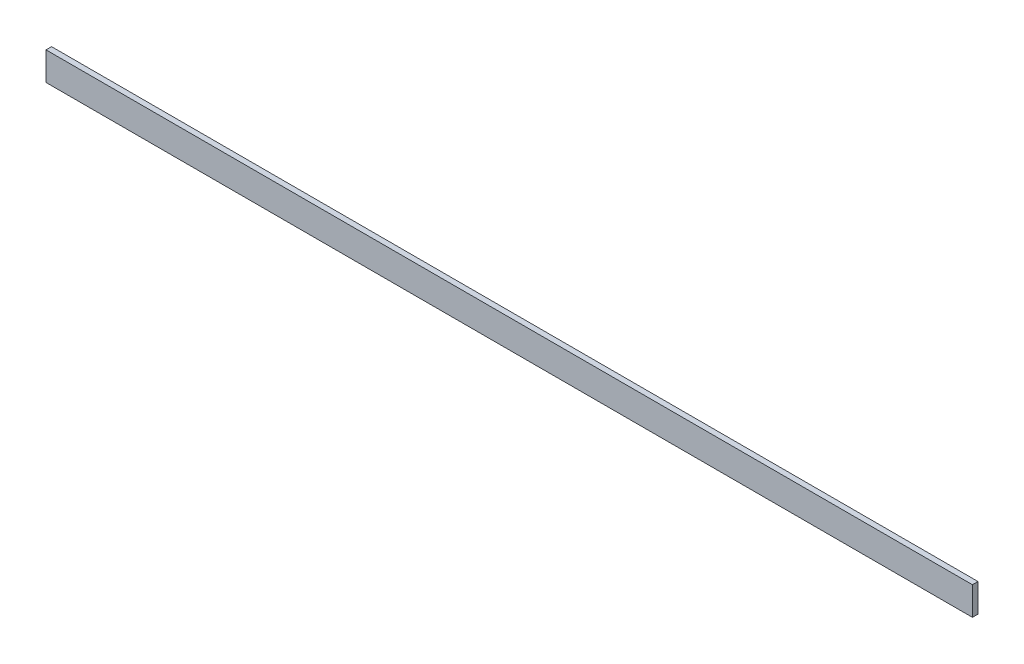
ISO-10303-21;
HEADER;
FILE_DESCRIPTION(('STEP AP214'),'2;1');
FILE_NAME('part.step','',(''),(''),'','','');
FILE_SCHEMA(('AUTOMOTIVE_DESIGN { 1 0 10303 214 1 1 1 1 }'));
ENDSEC;
DATA;
#1=APPLICATION_CONTEXT('core data for automotive mechanical design processes');
#2=APPLICATION_PROTOCOL_DEFINITION('international standard','automotive_design',2000,#1);
#3=PRODUCT_CONTEXT('',#1,'mechanical');
#4=PRODUCT('Part','Part','',(#3));
#5=PRODUCT_RELATED_PRODUCT_CATEGORY('part','',(#4));
#6=PRODUCT_DEFINITION_FORMATION('','',#4);
#7=PRODUCT_DEFINITION_CONTEXT('part definition',#1,'design');
#8=PRODUCT_DEFINITION('design','',#6,#7);
#9=PRODUCT_DEFINITION_SHAPE('','',#8);
#10=(LENGTH_UNIT() NAMED_UNIT(*) SI_UNIT(.MILLI.,.METRE.));
#11=(NAMED_UNIT(*) PLANE_ANGLE_UNIT() SI_UNIT($,.RADIAN.));
#12=(NAMED_UNIT(*) SI_UNIT($,.STERADIAN.) SOLID_ANGLE_UNIT());
#13=UNCERTAINTY_MEASURE_WITH_UNIT(LENGTH_MEASURE(1.E-05),#10,'distance_accuracy_value','');
#14=(GEOMETRIC_REPRESENTATION_CONTEXT(3) GLOBAL_UNCERTAINTY_ASSIGNED_CONTEXT((#13)) GLOBAL_UNIT_ASSIGNED_CONTEXT((#10,
#11,#12)) REPRESENTATION_CONTEXT('',''));
#15=CARTESIAN_POINT('',(0.,0.,0.));
#16=DIRECTION('',(0.,0.,1.));
#17=DIRECTION('',(1.,0.,0.));
#18=AXIS2_PLACEMENT_3D('',#15,#16,#17);
#19=CARTESIAN_POINT('',(-917.357864146204,-236.982,10.));
#20=DIRECTION('',(1.,0.,0.));
#21=DIRECTION('',(0.,0.,-1.));
#22=AXIS2_PLACEMENT_3D('',#19,#20,#21);
#23=PLANE('',#22);
#24=DIRECTION('',(0.,-1.,0.));
#25=VECTOR('',#24,1.);
#26=CARTESIAN_POINT('',(-917.357864146204,-236.982,0.));
#27=LINE('',#26,#25);
#28=CARTESIAN_POINT('',(-917.357864146204,-236.982,0.));
#29=VERTEX_POINT('',#28);
#30=CARTESIAN_POINT('',(-917.357864146204,-287.781,0.));
#31=VERTEX_POINT('',#30);
#32=EDGE_CURVE('E95',#29,#31,#27,.T.);
#33=ORIENTED_EDGE('',*,*,#32,.T.);
#34=DIRECTION('',(0.,0.,-1.));
#35=VECTOR('',#34,1.);
#36=CARTESIAN_POINT('',(-917.357864146204,-287.781,10.));
#37=LINE('',#36,#35);
#38=CARTESIAN_POINT('',(-917.357864146204,-287.781,10.));
#39=VERTEX_POINT('',#38);
#40=EDGE_CURVE('E11',#39,#31,#37,.T.);
#41=ORIENTED_EDGE('',*,*,#40,.F.);
#42=DIRECTION('',(0.,-1.,0.));
#43=VECTOR('',#42,1.);
#44=CARTESIAN_POINT('',(-917.357864146204,-236.982,10.));
#45=LINE('',#44,#43);
#46=CARTESIAN_POINT('',(-917.357864146204,-236.982,10.));
#47=VERTEX_POINT('',#46);
#48=EDGE_CURVE('E83',#47,#39,#45,.T.);
#49=ORIENTED_EDGE('',*,*,#48,.F.);
#50=DIRECTION('',(0.,0.,-1.));
#51=VECTOR('',#50,1.);
#52=CARTESIAN_POINT('',(-917.357864146204,-236.982,10.));
#53=LINE('',#52,#51);
#54=EDGE_CURVE('E91',#47,#29,#53,.T.);
#55=ORIENTED_EDGE('',*,*,#54,.T.);
#56=EDGE_LOOP('',(#33,#41,#49,#55));
#57=FACE_BOUND('',#56,.T.);
#58=ADVANCED_FACE('F32',(#57),#23,.F.);
#59=CARTESIAN_POINT('',(-917.357864146204,-287.781,10.));
#60=DIRECTION('',(0.,1.,0.));
#61=DIRECTION('',(0.,0.,1.));
#62=AXIS2_PLACEMENT_3D('',#59,#60,#61);
#63=PLANE('',#62);
#64=DIRECTION('',(1.,0.,0.));
#65=VECTOR('',#64,1.);
#66=CARTESIAN_POINT('',(-917.357864146204,-287.781,0.));
#67=LINE('',#66,#65);
#68=CARTESIAN_POINT('',(746.937280316701,-287.781,0.));
#69=VERTEX_POINT('',#68);
#70=EDGE_CURVE('E87',#31,#69,#67,.T.);
#71=ORIENTED_EDGE('',*,*,#70,.T.);
#72=DIRECTION('',(0.,0.,-1.));
#73=VECTOR('',#72,1.);
#74=CARTESIAN_POINT('',(746.937280316701,-287.781,10.));
#75=LINE('',#74,#73);
#76=CARTESIAN_POINT('',(746.937280316701,-287.781,10.));
#77=VERTEX_POINT('',#76);
#78=EDGE_CURVE('E40',#77,#69,#75,.T.);
#79=ORIENTED_EDGE('',*,*,#78,.F.);
#80=DIRECTION('',(1.,0.,0.));
#81=VECTOR('',#80,1.);
#82=CARTESIAN_POINT('',(-917.357864146204,-287.781,10.));
#83=LINE('',#82,#81);
#84=EDGE_CURVE('E78',#39,#77,#83,.T.);
#85=ORIENTED_EDGE('',*,*,#84,.F.);
#86=ORIENTED_EDGE('',*,*,#40,.T.);
#87=EDGE_LOOP('',(#71,#79,#85,#86));
#88=FACE_BOUND('',#87,.T.);
#89=ADVANCED_FACE('F86',(#88),#63,.F.);
#90=CARTESIAN_POINT('',(746.937280316701,-236.982,10.));
#91=DIRECTION('',(-1.,0.,0.));
#92=DIRECTION('',(0.,0.,1.));
#93=AXIS2_PLACEMENT_3D('',#90,#91,#92);
#94=PLANE('',#93);
#95=DIRECTION('',(0.,1.,0.));
#96=VECTOR('',#95,1.);
#97=CARTESIAN_POINT('',(746.937280316701,-236.982,0.));
#98=LINE('',#97,#96);
#99=CARTESIAN_POINT('',(746.937280316701,-236.982,0.));
#100=VERTEX_POINT('',#99);
#101=EDGE_CURVE('E65',#69,#100,#98,.T.);
#102=ORIENTED_EDGE('',*,*,#101,.T.);
#103=DIRECTION('',(0.,0.,-1.));
#104=VECTOR('',#103,1.);
#105=CARTESIAN_POINT('',(746.937280316701,-236.982,10.));
#106=LINE('',#105,#104);
#107=CARTESIAN_POINT('',(746.937280316701,-236.982,10.));
#108=VERTEX_POINT('',#107);
#109=EDGE_CURVE('E88',#108,#100,#106,.T.);
#110=ORIENTED_EDGE('',*,*,#109,.F.);
#111=DIRECTION('',(0.,1.,0.));
#112=VECTOR('',#111,1.);
#113=CARTESIAN_POINT('',(746.937280316701,-236.982,10.));
#114=LINE('',#113,#112);
#115=EDGE_CURVE('E81',#77,#108,#114,.T.);
#116=ORIENTED_EDGE('',*,*,#115,.F.);
#117=ORIENTED_EDGE('',*,*,#78,.T.);
#118=EDGE_LOOP('',(#102,#110,#116,#117));
#119=FACE_BOUND('',#118,.T.);
#120=ADVANCED_FACE('F89',(#119),#94,.F.);
#121=CARTESIAN_POINT('',(-917.357864146204,-236.982,10.));
#122=DIRECTION('',(0.,-1.,0.));
#123=DIRECTION('',(0.,0.,-1.));
#124=AXIS2_PLACEMENT_3D('',#121,#122,#123);
#125=PLANE('',#124);
#126=DIRECTION('',(-1.,0.,0.));
#127=VECTOR('',#126,1.);
#128=CARTESIAN_POINT('',(-917.357864146204,-236.982,0.));
#129=LINE('',#128,#127);
#130=EDGE_CURVE('E71',#100,#29,#129,.T.);
#131=ORIENTED_EDGE('',*,*,#130,.T.);
#132=ORIENTED_EDGE('',*,*,#54,.F.);
#133=DIRECTION('',(-1.,0.,0.));
#134=VECTOR('',#133,1.);
#135=CARTESIAN_POINT('',(-917.357864146204,-236.982,10.));
#136=LINE('',#135,#134);
#137=EDGE_CURVE('E48',#108,#47,#136,.T.);
#138=ORIENTED_EDGE('',*,*,#137,.F.);
#139=ORIENTED_EDGE('',*,*,#109,.T.);
#140=EDGE_LOOP('',(#131,#132,#138,#139));
#141=FACE_BOUND('',#140,.T.);
#142=ADVANCED_FACE('F102',(#141),#125,.F.);
#143=CARTESIAN_POINT('',(0.,0.,10.));
#144=DIRECTION('',(0.,0.,1.));
#145=DIRECTION('',(1.,0.,0.));
#146=AXIS2_PLACEMENT_3D('',#143,#144,#145);
#147=PLANE('',#146);
#148=ORIENTED_EDGE('',*,*,#48,.T.);
#149=ORIENTED_EDGE('',*,*,#84,.T.);
#150=ORIENTED_EDGE('',*,*,#115,.T.);
#151=ORIENTED_EDGE('',*,*,#137,.T.);
#152=EDGE_LOOP('',(#148,#149,#150,#151));
#153=FACE_BOUND('',#152,.T.);
#154=ADVANCED_FACE('F79',(#153),#147,.T.);
#155=CARTESIAN_POINT('',(0.,0.,0.));
#156=DIRECTION('',(0.,0.,1.));
#157=DIRECTION('',(1.,0.,0.));
#158=AXIS2_PLACEMENT_3D('',#155,#156,#157);
#159=PLANE('',#158);
#160=ORIENTED_EDGE('',*,*,#32,.F.);
#161=ORIENTED_EDGE('',*,*,#130,.F.);
#162=ORIENTED_EDGE('',*,*,#101,.F.);
#163=ORIENTED_EDGE('',*,*,#70,.F.);
#164=EDGE_LOOP('',(#160,#161,#162,#163));
#165=FACE_BOUND('',#164,.T.);
#166=ADVANCED_FACE('F105',(#165),#159,.F.);
#167=CLOSED_SHELL('',(#58,#89,#120,#142,#154,#166));
#168=MANIFOLD_SOLID_BREP('B2',#167);
#169=ADVANCED_BREP_SHAPE_REPRESENTATION('',(#18,#168),#14);
#170=SHAPE_DEFINITION_REPRESENTATION(#9,#169);
ENDSEC;
END-ISO-10303-21;
